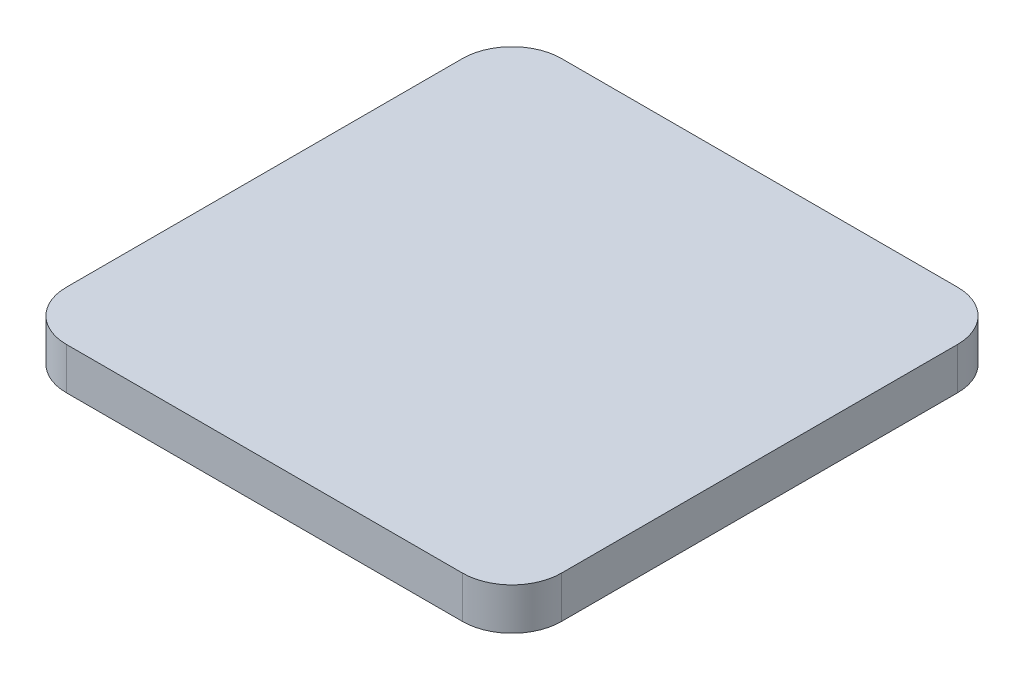
ISO-10303-21;
HEADER;
FILE_DESCRIPTION(('STEP AP214'),'2;1');
FILE_NAME('part.step','',(''),(''),'','','');
FILE_SCHEMA(('AUTOMOTIVE_DESIGN { 1 0 10303 214 1 1 1 1 }'));
ENDSEC;
DATA;
#1=APPLICATION_CONTEXT('core data for automotive mechanical design processes');
#2=APPLICATION_PROTOCOL_DEFINITION('international standard','automotive_design',2000,#1);
#3=PRODUCT_CONTEXT('',#1,'mechanical');
#4=PRODUCT('Part','Part','',(#3));
#5=PRODUCT_RELATED_PRODUCT_CATEGORY('part','',(#4));
#6=PRODUCT_DEFINITION_FORMATION('','',#4);
#7=PRODUCT_DEFINITION_CONTEXT('part definition',#1,'design');
#8=PRODUCT_DEFINITION('design','',#6,#7);
#9=PRODUCT_DEFINITION_SHAPE('','',#8);
#10=(LENGTH_UNIT() NAMED_UNIT(*) SI_UNIT(.MILLI.,.METRE.));
#11=(NAMED_UNIT(*) PLANE_ANGLE_UNIT() SI_UNIT($,.RADIAN.));
#12=(NAMED_UNIT(*) SI_UNIT($,.STERADIAN.) SOLID_ANGLE_UNIT());
#13=UNCERTAINTY_MEASURE_WITH_UNIT(LENGTH_MEASURE(1.E-05),#10,'distance_accuracy_value','');
#14=(GEOMETRIC_REPRESENTATION_CONTEXT(3) GLOBAL_UNCERTAINTY_ASSIGNED_CONTEXT((#13)) GLOBAL_UNIT_ASSIGNED_CONTEXT((#10,
#11,#12)) REPRESENTATION_CONTEXT('',''));
#15=CARTESIAN_POINT('',(0.,0.,0.));
#16=DIRECTION('',(0.,0.,1.));
#17=DIRECTION('',(1.,0.,0.));
#18=AXIS2_PLACEMENT_3D('',#15,#16,#17);
#19=CARTESIAN_POINT('',(15.,2.54,-15.));
#20=DIRECTION('',(-1.,0.,0.));
#21=DIRECTION('',(0.,0.,1.));
#22=AXIS2_PLACEMENT_3D('',#19,#20,#21);
#23=PLANE('',#22);
#24=DIRECTION('',(0.,0.,-1.));
#25=VECTOR('',#24,1.);
#26=CARTESIAN_POINT('',(15.,0.,-15.));
#27=LINE('',#26,#25);
#28=CARTESIAN_POINT('',(15.,0.,12.));
#29=VERTEX_POINT('',#28);
#30=CARTESIAN_POINT('',(15.,0.,-12.));
#31=VERTEX_POINT('',#30);
#32=EDGE_CURVE('E133',#29,#31,#27,.T.);
#33=ORIENTED_EDGE('',*,*,#32,.T.);
#34=DIRECTION('',(0.,-1.,0.));
#35=VECTOR('',#34,1.);
#36=CARTESIAN_POINT('',(15.,2.54,-12.));
#37=LINE('',#36,#35);
#38=CARTESIAN_POINT('',(15.,2.54,-12.));
#39=VERTEX_POINT('',#38);
#40=EDGE_CURVE('E11',#31,#39,#37,.F.);
#41=ORIENTED_EDGE('',*,*,#40,.T.);
#42=DIRECTION('',(0.,0.,-1.));
#43=VECTOR('',#42,1.);
#44=CARTESIAN_POINT('',(15.,2.54,-15.));
#45=LINE('',#44,#43);
#46=CARTESIAN_POINT('',(15.,2.54,12.));
#47=VERTEX_POINT('',#46);
#48=EDGE_CURVE('E131',#47,#39,#45,.T.);
#49=ORIENTED_EDGE('',*,*,#48,.F.);
#50=DIRECTION('',(0.,-1.,0.));
#51=VECTOR('',#50,1.);
#52=CARTESIAN_POINT('',(15.,2.54,12.));
#53=LINE('',#52,#51);
#54=EDGE_CURVE('E45',#47,#29,#53,.T.);
#55=ORIENTED_EDGE('',*,*,#54,.T.);
#56=EDGE_LOOP('',(#33,#41,#49,#55));
#57=FACE_BOUND('',#56,.T.);
#58=ADVANCED_FACE('F37',(#57),#23,.F.);
#59=CARTESIAN_POINT('',(-15.,2.54,-15.));
#60=DIRECTION('',(0.,0.,1.));
#61=DIRECTION('',(1.,0.,0.));
#62=AXIS2_PLACEMENT_3D('',#59,#60,#61);
#63=PLANE('',#62);
#64=DIRECTION('',(-1.,0.,0.));
#65=VECTOR('',#64,1.);
#66=CARTESIAN_POINT('',(-15.,0.,-15.));
#67=LINE('',#66,#65);
#68=CARTESIAN_POINT('',(12.,0.,-15.));
#69=VERTEX_POINT('',#68);
#70=CARTESIAN_POINT('',(-12.,0.,-15.));
#71=VERTEX_POINT('',#70);
#72=EDGE_CURVE('E129',#69,#71,#67,.T.);
#73=ORIENTED_EDGE('',*,*,#72,.T.);
#74=DIRECTION('',(0.,-1.,0.));
#75=VECTOR('',#74,1.);
#76=CARTESIAN_POINT('',(-12.,2.54,-15.));
#77=LINE('',#76,#75);
#78=CARTESIAN_POINT('',(-12.,2.54,-15.));
#79=VERTEX_POINT('',#78);
#80=EDGE_CURVE('E108',#71,#79,#77,.F.);
#81=ORIENTED_EDGE('',*,*,#80,.T.);
#82=DIRECTION('',(-1.,0.,0.));
#83=VECTOR('',#82,1.);
#84=CARTESIAN_POINT('',(-15.,2.54,-15.));
#85=LINE('',#84,#83);
#86=CARTESIAN_POINT('',(12.,2.54,-15.));
#87=VERTEX_POINT('',#86);
#88=EDGE_CURVE('E169',#87,#79,#85,.T.);
#89=ORIENTED_EDGE('',*,*,#88,.F.);
#90=DIRECTION('',(0.,-1.,0.));
#91=VECTOR('',#90,1.);
#92=CARTESIAN_POINT('',(12.,2.54,-15.));
#93=LINE('',#92,#91);
#94=EDGE_CURVE('E113',#87,#69,#93,.T.);
#95=ORIENTED_EDGE('',*,*,#94,.T.);
#96=EDGE_LOOP('',(#73,#81,#89,#95));
#97=FACE_BOUND('',#96,.T.);
#98=ADVANCED_FACE('F179',(#97),#63,.F.);
#99=CARTESIAN_POINT('',(-15.,2.54,-15.));
#100=DIRECTION('',(1.,0.,0.));
#101=DIRECTION('',(0.,0.,-1.));
#102=AXIS2_PLACEMENT_3D('',#99,#100,#101);
#103=PLANE('',#102);
#104=DIRECTION('',(0.,0.,1.));
#105=VECTOR('',#104,1.);
#106=CARTESIAN_POINT('',(-15.,2.54,-15.));
#107=LINE('',#106,#105);
#108=CARTESIAN_POINT('',(-15.,2.54,-12.));
#109=VERTEX_POINT('',#108);
#110=CARTESIAN_POINT('',(-15.,2.54,12.));
#111=VERTEX_POINT('',#110);
#112=EDGE_CURVE('E122',#109,#111,#107,.T.);
#113=ORIENTED_EDGE('',*,*,#112,.F.);
#114=DIRECTION('',(0.,-1.,0.));
#115=VECTOR('',#114,1.);
#116=CARTESIAN_POINT('',(-15.,2.54,-12.));
#117=LINE('',#116,#115);
#118=CARTESIAN_POINT('',(-15.,0.,-12.));
#119=VERTEX_POINT('',#118);
#120=EDGE_CURVE('E107',#109,#119,#117,.T.);
#121=ORIENTED_EDGE('',*,*,#120,.T.);
#122=DIRECTION('',(0.,0.,1.));
#123=VECTOR('',#122,1.);
#124=CARTESIAN_POINT('',(-15.,0.,-15.));
#125=LINE('',#124,#123);
#126=CARTESIAN_POINT('',(-15.,0.,12.));
#127=VERTEX_POINT('',#126);
#128=EDGE_CURVE('E120',#119,#127,#125,.T.);
#129=ORIENTED_EDGE('',*,*,#128,.T.);
#130=DIRECTION('',(0.,-1.,0.));
#131=VECTOR('',#130,1.);
#132=CARTESIAN_POINT('',(-15.,2.54,12.));
#133=LINE('',#132,#131);
#134=EDGE_CURVE('E124',#127,#111,#133,.F.);
#135=ORIENTED_EDGE('',*,*,#134,.T.);
#136=EDGE_LOOP('',(#113,#121,#129,#135));
#137=FACE_BOUND('',#136,.T.);
#138=ADVANCED_FACE('F119',(#137),#103,.F.);
#139=CARTESIAN_POINT('',(-15.,2.54,15.));
#140=DIRECTION('',(0.,0.,-1.));
#141=DIRECTION('',(-1.,0.,0.));
#142=AXIS2_PLACEMENT_3D('',#139,#140,#141);
#143=PLANE('',#142);
#144=DIRECTION('',(1.,0.,0.));
#145=VECTOR('',#144,1.);
#146=CARTESIAN_POINT('',(-15.,2.54,15.));
#147=LINE('',#146,#145);
#148=CARTESIAN_POINT('',(-12.,2.54,15.));
#149=VERTEX_POINT('',#148);
#150=CARTESIAN_POINT('',(12.,2.54,15.));
#151=VERTEX_POINT('',#150);
#152=EDGE_CURVE('E137',#149,#151,#147,.T.);
#153=ORIENTED_EDGE('',*,*,#152,.F.);
#154=DIRECTION('',(0.,-1.,0.));
#155=VECTOR('',#154,1.);
#156=CARTESIAN_POINT('',(-12.,2.54,15.));
#157=LINE('',#156,#155);
#158=CARTESIAN_POINT('',(-12.,0.,15.));
#159=VERTEX_POINT('',#158);
#160=EDGE_CURVE('E154',#149,#159,#157,.T.);
#161=ORIENTED_EDGE('',*,*,#160,.T.);
#162=DIRECTION('',(1.,0.,0.));
#163=VECTOR('',#162,1.);
#164=CARTESIAN_POINT('',(-15.,0.,15.));
#165=LINE('',#164,#163);
#166=CARTESIAN_POINT('',(12.,0.,15.));
#167=VERTEX_POINT('',#166);
#168=EDGE_CURVE('E128',#159,#167,#165,.T.);
#169=ORIENTED_EDGE('',*,*,#168,.T.);
#170=DIRECTION('',(0.,-1.,0.));
#171=VECTOR('',#170,1.);
#172=CARTESIAN_POINT('',(12.,2.54,15.));
#173=LINE('',#172,#171);
#174=EDGE_CURVE('E52',#167,#151,#173,.F.);
#175=ORIENTED_EDGE('',*,*,#174,.T.);
#176=EDGE_LOOP('',(#153,#161,#169,#175));
#177=FACE_BOUND('',#176,.T.);
#178=ADVANCED_FACE('F183',(#177),#143,.F.);
#179=CARTESIAN_POINT('',(0.,2.54,0.));
#180=DIRECTION('',(0.,1.,0.));
#181=DIRECTION('',(0.,0.,1.));
#182=AXIS2_PLACEMENT_3D('',#179,#180,#181);
#183=PLANE('',#182);
#184=ORIENTED_EDGE('',*,*,#88,.T.);
#185=CARTESIAN_POINT('',(-12.,2.54,-12.));
#186=DIRECTION('',(0.,1.,0.));
#187=DIRECTION('',(0.,0.,1.));
#188=AXIS2_PLACEMENT_3D('',#185,#186,#187);
#189=CIRCLE('',#188,3.);
#190=EDGE_CURVE('E151',#79,#109,#189,.T.);
#191=ORIENTED_EDGE('',*,*,#190,.T.);
#192=ORIENTED_EDGE('',*,*,#112,.T.);
#193=CARTESIAN_POINT('',(-12.,2.54,12.));
#194=DIRECTION('',(0.,1.,0.));
#195=DIRECTION('',(0.,0.,1.));
#196=AXIS2_PLACEMENT_3D('',#193,#194,#195);
#197=CIRCLE('',#196,3.);
#198=EDGE_CURVE('E59',#111,#149,#197,.T.);
#199=ORIENTED_EDGE('',*,*,#198,.T.);
#200=ORIENTED_EDGE('',*,*,#152,.T.);
#201=CARTESIAN_POINT('',(12.,2.54,12.));
#202=DIRECTION('',(0.,1.,0.));
#203=DIRECTION('',(0.,0.,1.));
#204=AXIS2_PLACEMENT_3D('',#201,#202,#203);
#205=CIRCLE('',#204,3.);
#206=EDGE_CURVE('E146',#151,#47,#205,.T.);
#207=ORIENTED_EDGE('',*,*,#206,.T.);
#208=ORIENTED_EDGE('',*,*,#48,.T.);
#209=CARTESIAN_POINT('',(12.,2.54,-12.));
#210=DIRECTION('',(0.,1.,0.));
#211=DIRECTION('',(0.,0.,1.));
#212=AXIS2_PLACEMENT_3D('',#209,#210,#211);
#213=CIRCLE('',#212,3.);
#214=EDGE_CURVE('E148',#39,#87,#213,.T.);
#215=ORIENTED_EDGE('',*,*,#214,.T.);
#216=EDGE_LOOP('',(#184,#191,#192,#199,#200,#207,#208,#215));
#217=FACE_BOUND('',#216,.T.);
#218=ADVANCED_FACE('F173',(#217),#183,.T.);
#219=CARTESIAN_POINT('',(0.,0.,0.));
#220=DIRECTION('',(0.,1.,0.));
#221=DIRECTION('',(0.,0.,1.));
#222=AXIS2_PLACEMENT_3D('',#219,#220,#221);
#223=PLANE('',#222);
#224=ORIENTED_EDGE('',*,*,#128,.F.);
#225=CARTESIAN_POINT('',(-12.,0.,-12.));
#226=DIRECTION('',(0.,1.,0.));
#227=DIRECTION('',(0.,0.,1.));
#228=AXIS2_PLACEMENT_3D('',#225,#226,#227);
#229=CIRCLE('',#228,3.);
#230=EDGE_CURVE('E103',#119,#71,#229,.F.);
#231=ORIENTED_EDGE('',*,*,#230,.T.);
#232=ORIENTED_EDGE('',*,*,#72,.F.);
#233=CARTESIAN_POINT('',(12.,0.,-12.));
#234=DIRECTION('',(0.,1.,0.));
#235=DIRECTION('',(0.,0.,1.));
#236=AXIS2_PLACEMENT_3D('',#233,#234,#235);
#237=CIRCLE('',#236,3.);
#238=EDGE_CURVE('E140',#69,#31,#237,.F.);
#239=ORIENTED_EDGE('',*,*,#238,.T.);
#240=ORIENTED_EDGE('',*,*,#32,.F.);
#241=CARTESIAN_POINT('',(12.,0.,12.));
#242=DIRECTION('',(0.,1.,0.));
#243=DIRECTION('',(0.,0.,1.));
#244=AXIS2_PLACEMENT_3D('',#241,#242,#243);
#245=CIRCLE('',#244,3.);
#246=EDGE_CURVE('E123',#29,#167,#245,.F.);
#247=ORIENTED_EDGE('',*,*,#246,.T.);
#248=ORIENTED_EDGE('',*,*,#168,.F.);
#249=CARTESIAN_POINT('',(-12.,0.,12.));
#250=DIRECTION('',(0.,1.,0.));
#251=DIRECTION('',(0.,0.,1.));
#252=AXIS2_PLACEMENT_3D('',#249,#250,#251);
#253=CIRCLE('',#252,3.);
#254=EDGE_CURVE('E114',#159,#127,#253,.F.);
#255=ORIENTED_EDGE('',*,*,#254,.T.);
#256=EDGE_LOOP('',(#224,#231,#232,#239,#240,#247,#248,#255));
#257=FACE_BOUND('',#256,.T.);
#258=ADVANCED_FACE('F126',(#257),#223,.F.);
#259=CARTESIAN_POINT('',(-12.,2.54,-12.));
#260=DIRECTION('',(0.,-1.,0.));
#261=DIRECTION('',(0.,0.,-1.));
#262=AXIS2_PLACEMENT_3D('',#259,#260,#261);
#263=CYLINDRICAL_SURFACE('',#262,3.);
#264=ORIENTED_EDGE('',*,*,#190,.F.);
#265=ORIENTED_EDGE('',*,*,#80,.F.);
#266=ORIENTED_EDGE('',*,*,#230,.F.);
#267=ORIENTED_EDGE('',*,*,#120,.F.);
#268=EDGE_LOOP('',(#264,#265,#266,#267));
#269=FACE_BOUND('',#268,.T.);
#270=ADVANCED_FACE('F106',(#269),#263,.T.);
#271=CARTESIAN_POINT('',(-12.,2.54,12.));
#272=DIRECTION('',(0.,-1.,0.));
#273=DIRECTION('',(0.,0.,-1.));
#274=AXIS2_PLACEMENT_3D('',#271,#272,#273);
#275=CYLINDRICAL_SURFACE('',#274,3.);
#276=ORIENTED_EDGE('',*,*,#198,.F.);
#277=ORIENTED_EDGE('',*,*,#134,.F.);
#278=ORIENTED_EDGE('',*,*,#254,.F.);
#279=ORIENTED_EDGE('',*,*,#160,.F.);
#280=EDGE_LOOP('',(#276,#277,#278,#279));
#281=FACE_BOUND('',#280,.T.);
#282=ADVANCED_FACE('F182',(#281),#275,.T.);
#283=CARTESIAN_POINT('',(12.,2.54,-12.));
#284=DIRECTION('',(0.,-1.,0.));
#285=DIRECTION('',(0.,0.,-1.));
#286=AXIS2_PLACEMENT_3D('',#283,#284,#285);
#287=CYLINDRICAL_SURFACE('',#286,3.);
#288=ORIENTED_EDGE('',*,*,#214,.F.);
#289=ORIENTED_EDGE('',*,*,#40,.F.);
#290=ORIENTED_EDGE('',*,*,#238,.F.);
#291=ORIENTED_EDGE('',*,*,#94,.F.);
#292=EDGE_LOOP('',(#288,#289,#290,#291));
#293=FACE_BOUND('',#292,.T.);
#294=ADVANCED_FACE('F177',(#293),#287,.T.);
#295=CARTESIAN_POINT('',(12.,2.54,12.));
#296=DIRECTION('',(0.,-1.,0.));
#297=DIRECTION('',(0.,0.,-1.));
#298=AXIS2_PLACEMENT_3D('',#295,#296,#297);
#299=CYLINDRICAL_SURFACE('',#298,3.);
#300=ORIENTED_EDGE('',*,*,#206,.F.);
#301=ORIENTED_EDGE('',*,*,#174,.F.);
#302=ORIENTED_EDGE('',*,*,#246,.F.);
#303=ORIENTED_EDGE('',*,*,#54,.F.);
#304=EDGE_LOOP('',(#300,#301,#302,#303));
#305=FACE_BOUND('',#304,.T.);
#306=ADVANCED_FACE('F39',(#305),#299,.T.);
#307=CLOSED_SHELL('',(#58,#98,#138,#178,#218,#258,#270,#282,#294,#306));
#308=MANIFOLD_SOLID_BREP('B2',#307);
#309=ADVANCED_BREP_SHAPE_REPRESENTATION('',(#18,#308),#14);
#310=SHAPE_DEFINITION_REPRESENTATION(#9,#309);
ENDSEC;
END-ISO-10303-21;
